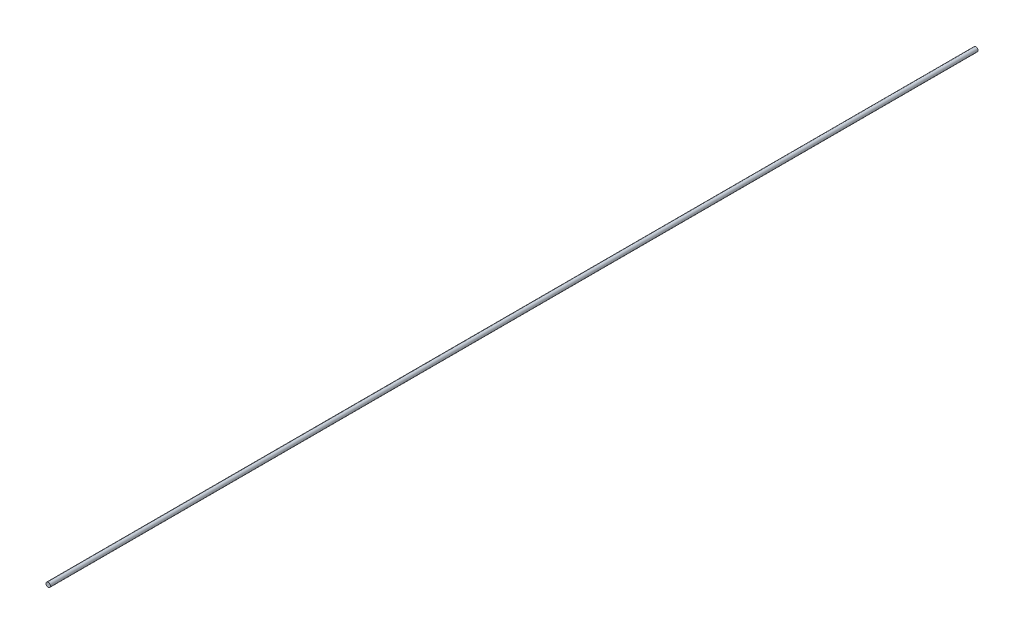
ISO-10303-21;
HEADER;
FILE_DESCRIPTION(('STEP AP214'),'2;1');
FILE_NAME('part.step','',(''),(''),'','','');
FILE_SCHEMA(('AUTOMOTIVE_DESIGN { 1 0 10303 214 1 1 1 1 }'));
ENDSEC;
DATA;
#1=APPLICATION_CONTEXT('core data for automotive mechanical design processes');
#2=APPLICATION_PROTOCOL_DEFINITION('international standard','automotive_design',2000,#1);
#3=PRODUCT_CONTEXT('',#1,'mechanical');
#4=PRODUCT('Part','Part','',(#3));
#5=PRODUCT_RELATED_PRODUCT_CATEGORY('part','',(#4));
#6=PRODUCT_DEFINITION_FORMATION('','',#4);
#7=PRODUCT_DEFINITION_CONTEXT('part definition',#1,'design');
#8=PRODUCT_DEFINITION('design','',#6,#7);
#9=PRODUCT_DEFINITION_SHAPE('','',#8);
#10=(LENGTH_UNIT() NAMED_UNIT(*) SI_UNIT(.MILLI.,.METRE.));
#11=(NAMED_UNIT(*) PLANE_ANGLE_UNIT() SI_UNIT($,.RADIAN.));
#12=(NAMED_UNIT(*) SI_UNIT($,.STERADIAN.) SOLID_ANGLE_UNIT());
#13=UNCERTAINTY_MEASURE_WITH_UNIT(LENGTH_MEASURE(1.E-05),#10,'distance_accuracy_value','');
#14=(GEOMETRIC_REPRESENTATION_CONTEXT(3) GLOBAL_UNCERTAINTY_ASSIGNED_CONTEXT((#13)) GLOBAL_UNIT_ASSIGNED_CONTEXT((#10,
#11,#12)) REPRESENTATION_CONTEXT('',''));
#15=CARTESIAN_POINT('',(0.,0.,0.));
#16=DIRECTION('',(0.,0.,1.));
#17=DIRECTION('',(1.,0.,0.));
#18=AXIS2_PLACEMENT_3D('',#15,#16,#17);
#19=CARTESIAN_POINT('',(0.,0.,169.664140853418));
#20=DIRECTION('',(0.,0.,-1.));
#21=DIRECTION('',(-1.,0.,0.));
#22=AXIS2_PLACEMENT_3D('',#19,#20,#21);
#23=CYLINDRICAL_SURFACE('',#22,0.4);
#24=CARTESIAN_POINT('',(0.,0.,169.664140853418));
#25=DIRECTION('',(0.,0.,1.));
#26=DIRECTION('',(1.,0.,0.));
#27=AXIS2_PLACEMENT_3D('',#24,#25,#26);
#28=CIRCLE('',#27,0.4);
#29=CARTESIAN_POINT('',(0.4,0.,169.664140853418));
#30=VERTEX_POINT('',#29);
#31=EDGE_CURVE('E10',#30,#30,#28,.T.);
#32=ORIENTED_EDGE('',*,*,#31,.F.);
#33=EDGE_LOOP('',(#32));
#34=FACE_BOUND('',#33,.T.);
#35=CARTESIAN_POINT('',(0.,0.,0.));
#36=DIRECTION('',(0.,0.,1.));
#37=DIRECTION('',(1.,0.,0.));
#38=AXIS2_PLACEMENT_3D('',#35,#36,#37);
#39=CIRCLE('',#38,0.4);
#40=CARTESIAN_POINT('',(0.4,0.,0.));
#41=VERTEX_POINT('',#40);
#42=EDGE_CURVE('E44',#41,#41,#39,.T.);
#43=ORIENTED_EDGE('',*,*,#42,.T.);
#44=EDGE_LOOP('',(#43));
#45=FACE_BOUND('',#44,.T.);
#46=ADVANCED_FACE('F41',(#34,#45),#23,.T.);
#47=CARTESIAN_POINT('',(0.,0.,169.664140853418));
#48=DIRECTION('',(0.,0.,1.));
#49=DIRECTION('',(1.,0.,0.));
#50=AXIS2_PLACEMENT_3D('',#47,#48,#49);
#51=PLANE('',#50);
#52=ORIENTED_EDGE('',*,*,#31,.T.);
#53=EDGE_LOOP('',(#52));
#54=FACE_BOUND('',#53,.T.);
#55=ADVANCED_FACE('F58',(#54),#51,.T.);
#56=CARTESIAN_POINT('',(0.,0.,0.));
#57=DIRECTION('',(0.,0.,1.));
#58=DIRECTION('',(1.,0.,0.));
#59=AXIS2_PLACEMENT_3D('',#56,#57,#58);
#60=PLANE('',#59);
#61=ORIENTED_EDGE('',*,*,#42,.F.);
#62=EDGE_LOOP('',(#61));
#63=FACE_BOUND('',#62,.T.);
#64=ADVANCED_FACE('F56',(#63),#60,.F.);
#65=CLOSED_SHELL('',(#46,#55,#64));
#66=MANIFOLD_SOLID_BREP('B2',#65);
#67=ADVANCED_BREP_SHAPE_REPRESENTATION('',(#18,#66),#14);
#68=SHAPE_DEFINITION_REPRESENTATION(#9,#67);
ENDSEC;
END-ISO-10303-21;
